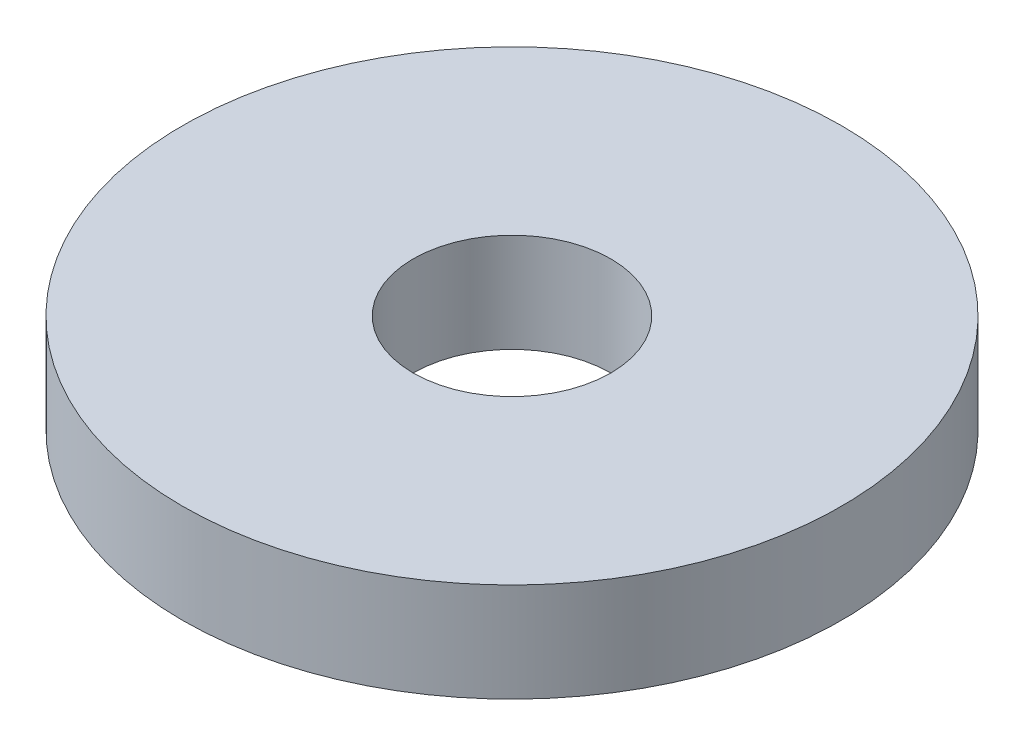
ISO-10303-21;
HEADER;
FILE_DESCRIPTION(('STEP AP214'),'2;1');
FILE_NAME('part.step','',(''),(''),'','','');
FILE_SCHEMA(('AUTOMOTIVE_DESIGN { 1 0 10303 214 1 1 1 1 }'));
ENDSEC;
DATA;
#1=APPLICATION_CONTEXT('core data for automotive mechanical design processes');
#2=APPLICATION_PROTOCOL_DEFINITION('international standard','automotive_design',2000,#1);
#3=PRODUCT_CONTEXT('',#1,'mechanical');
#4=PRODUCT('Part','Part','',(#3));
#5=PRODUCT_RELATED_PRODUCT_CATEGORY('part','',(#4));
#6=PRODUCT_DEFINITION_FORMATION('','',#4);
#7=PRODUCT_DEFINITION_CONTEXT('part definition',#1,'design');
#8=PRODUCT_DEFINITION('design','',#6,#7);
#9=PRODUCT_DEFINITION_SHAPE('','',#8);
#10=(LENGTH_UNIT() NAMED_UNIT(*) SI_UNIT(.MILLI.,.METRE.));
#11=(NAMED_UNIT(*) PLANE_ANGLE_UNIT() SI_UNIT($,.RADIAN.));
#12=(NAMED_UNIT(*) SI_UNIT($,.STERADIAN.) SOLID_ANGLE_UNIT());
#13=UNCERTAINTY_MEASURE_WITH_UNIT(LENGTH_MEASURE(1.E-05),#10,'distance_accuracy_value','');
#14=(GEOMETRIC_REPRESENTATION_CONTEXT(3) GLOBAL_UNCERTAINTY_ASSIGNED_CONTEXT((#13)) GLOBAL_UNIT_ASSIGNED_CONTEXT((#10,
#11,#12)) REPRESENTATION_CONTEXT('',''));
#15=CARTESIAN_POINT('',(0.,0.,0.));
#16=DIRECTION('',(0.,0.,1.));
#17=DIRECTION('',(1.,0.,0.));
#18=AXIS2_PLACEMENT_3D('',#15,#16,#17);
#19=CARTESIAN_POINT('',(0.,1.5,0.));
#20=DIRECTION('',(0.,1.,0.));
#21=DIRECTION('',(0.,0.,1.));
#22=AXIS2_PLACEMENT_3D('',#19,#20,#21);
#23=PLANE('',#22);
#24=CARTESIAN_POINT('',(0.,1.5,0.));
#25=DIRECTION('',(0.,1.,0.));
#26=DIRECTION('',(0.,0.,1.));
#27=AXIS2_PLACEMENT_3D('',#24,#25,#26);
#28=CIRCLE('',#27,5.);
#29=CARTESIAN_POINT('',(0.,1.5,5.));
#30=VERTEX_POINT('',#29);
#31=EDGE_CURVE('E10',#30,#30,#28,.T.);
#32=ORIENTED_EDGE('',*,*,#31,.T.);
#33=EDGE_LOOP('',(#32));
#34=FACE_BOUND('',#33,.T.);
#35=CARTESIAN_POINT('',(0.,1.5,0.));
#36=DIRECTION('',(0.,1.,0.));
#37=DIRECTION('',(0.,0.,1.));
#38=AXIS2_PLACEMENT_3D('',#35,#36,#37);
#39=CIRCLE('',#38,1.5);
#40=CARTESIAN_POINT('',(0.,1.5,1.5));
#41=VERTEX_POINT('',#40);
#42=EDGE_CURVE('E42',#41,#41,#39,.T.);
#43=ORIENTED_EDGE('',*,*,#42,.F.);
#44=EDGE_LOOP('',(#43));
#45=FACE_BOUND('',#44,.T.);
#46=ADVANCED_FACE('F31',(#34,#45),#23,.T.);
#47=CARTESIAN_POINT('',(0.,0.,0.));
#48=DIRECTION('',(0.,1.,0.));
#49=DIRECTION('',(0.,0.,1.));
#50=AXIS2_PLACEMENT_3D('',#47,#48,#49);
#51=PLANE('',#50);
#52=CARTESIAN_POINT('',(0.,0.,0.));
#53=DIRECTION('',(0.,1.,0.));
#54=DIRECTION('',(0.,0.,1.));
#55=AXIS2_PLACEMENT_3D('',#52,#53,#54);
#56=CIRCLE('',#55,5.);
#57=CARTESIAN_POINT('',(0.,0.,5.));
#58=VERTEX_POINT('',#57);
#59=EDGE_CURVE('E35',#58,#58,#56,.T.);
#60=ORIENTED_EDGE('',*,*,#59,.F.);
#61=EDGE_LOOP('',(#60));
#62=FACE_BOUND('',#61,.T.);
#63=CARTESIAN_POINT('',(0.,0.,0.));
#64=DIRECTION('',(0.,1.,0.));
#65=DIRECTION('',(0.,0.,1.));
#66=AXIS2_PLACEMENT_3D('',#63,#64,#65);
#67=CIRCLE('',#66,1.5);
#68=CARTESIAN_POINT('',(0.,0.,1.5));
#69=VERTEX_POINT('',#68);
#70=EDGE_CURVE('E44',#69,#69,#67,.T.);
#71=ORIENTED_EDGE('',*,*,#70,.T.);
#72=EDGE_LOOP('',(#71));
#73=FACE_BOUND('',#72,.T.);
#74=ADVANCED_FACE('F54',(#62,#73),#51,.F.);
#75=CARTESIAN_POINT('',(0.,1.5,0.));
#76=DIRECTION('',(0.,-1.,0.));
#77=DIRECTION('',(0.,0.,-1.));
#78=AXIS2_PLACEMENT_3D('',#75,#76,#77);
#79=CYLINDRICAL_SURFACE('',#78,5.);
#80=ORIENTED_EDGE('',*,*,#31,.F.);
#81=EDGE_LOOP('',(#80));
#82=FACE_BOUND('',#81,.T.);
#83=ORIENTED_EDGE('',*,*,#59,.T.);
#84=EDGE_LOOP('',(#83));
#85=FACE_BOUND('',#84,.T.);
#86=ADVANCED_FACE('F33',(#82,#85),#79,.T.);
#87=CARTESIAN_POINT('',(0.,1.5,0.));
#88=DIRECTION('',(0.,-1.,0.));
#89=DIRECTION('',(0.,0.,-1.));
#90=AXIS2_PLACEMENT_3D('',#87,#88,#89);
#91=CYLINDRICAL_SURFACE('',#90,1.5);
#92=ORIENTED_EDGE('',*,*,#42,.T.);
#93=EDGE_LOOP('',(#92));
#94=FACE_BOUND('',#93,.T.);
#95=ORIENTED_EDGE('',*,*,#70,.F.);
#96=EDGE_LOOP('',(#95));
#97=FACE_BOUND('',#96,.T.);
#98=ADVANCED_FACE('F50',(#94,#97),#91,.F.);
#99=CLOSED_SHELL('',(#46,#74,#86,#98));
#100=MANIFOLD_SOLID_BREP('B2',#99);
#101=ADVANCED_BREP_SHAPE_REPRESENTATION('',(#18,#100),#14);
#102=SHAPE_DEFINITION_REPRESENTATION(#9,#101);
ENDSEC;
END-ISO-10303-21;
